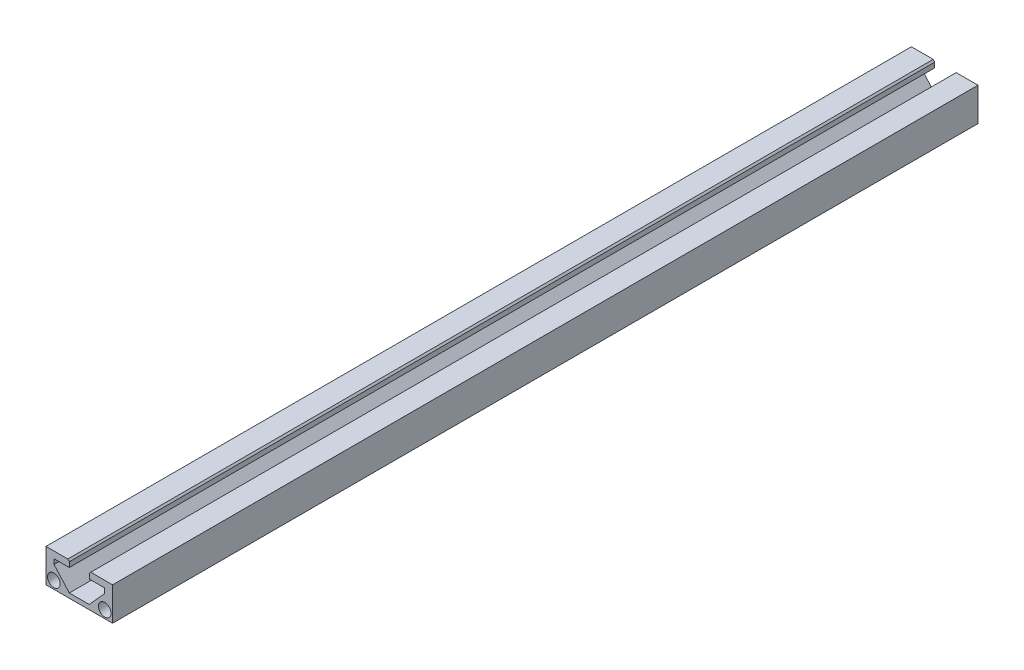
ISO-10303-21;
HEADER;
FILE_DESCRIPTION(('STEP AP214'),'2;1');
FILE_NAME('part.step','',(''),(''),'','','');
FILE_SCHEMA(('AUTOMOTIVE_DESIGN { 1 0 10303 214 1 1 1 1 }'));
ENDSEC;
DATA;
#1=APPLICATION_CONTEXT('core data for automotive mechanical design processes');
#2=APPLICATION_PROTOCOL_DEFINITION('international standard','automotive_design',2000,#1);
#3=PRODUCT_CONTEXT('',#1,'mechanical');
#4=PRODUCT('Part','Part','',(#3));
#5=PRODUCT_RELATED_PRODUCT_CATEGORY('part','',(#4));
#6=PRODUCT_DEFINITION_FORMATION('','',#4);
#7=PRODUCT_DEFINITION_CONTEXT('part definition',#1,'design');
#8=PRODUCT_DEFINITION('design','',#6,#7);
#9=PRODUCT_DEFINITION_SHAPE('','',#8);
#10=(LENGTH_UNIT() NAMED_UNIT(*) SI_UNIT(.MILLI.,.METRE.));
#11=(NAMED_UNIT(*) PLANE_ANGLE_UNIT() SI_UNIT($,.RADIAN.));
#12=(NAMED_UNIT(*) SI_UNIT($,.STERADIAN.) SOLID_ANGLE_UNIT());
#13=UNCERTAINTY_MEASURE_WITH_UNIT(LENGTH_MEASURE(1.E-05),#10,'distance_accuracy_value','');
#14=(GEOMETRIC_REPRESENTATION_CONTEXT(3) GLOBAL_UNCERTAINTY_ASSIGNED_CONTEXT((#13)) GLOBAL_UNIT_ASSIGNED_CONTEXT((#10,
#11,#12)) REPRESENTATION_CONTEXT('',''));
#15=CARTESIAN_POINT('',(0.,0.,0.));
#16=DIRECTION('',(0.,0.,1.));
#17=DIRECTION('',(1.,0.,0.));
#18=AXIS2_PLACEMENT_3D('',#15,#16,#17);
#19=CARTESIAN_POINT('',(3.,0.,130.));
#20=DIRECTION('',(0.,-1.,0.));
#21=DIRECTION('',(1.,0.,0.));
#22=AXIS2_PLACEMENT_3D('',#19,#20,#21);
#23=PLANE('',#22);
#24=DIRECTION('',(-1.,0.,0.));
#25=VECTOR('',#24,1.);
#26=CARTESIAN_POINT('',(3.,0.,-130.));
#27=LINE('',#26,#25);
#28=CARTESIAN_POINT('',(3.,0.,-130.));
#29=VERTEX_POINT('',#28);
#30=CARTESIAN_POINT('',(-3.,0.,-130.));
#31=VERTEX_POINT('',#30);
#32=EDGE_CURVE('E145',#29,#31,#27,.T.);
#33=ORIENTED_EDGE('',*,*,#32,.T.);
#34=DIRECTION('',(0.,0.,-1.));
#35=VECTOR('',#34,1.);
#36=CARTESIAN_POINT('',(-3.,0.,130.));
#37=LINE('',#36,#35);
#38=CARTESIAN_POINT('',(-3.,0.,130.));
#39=VERTEX_POINT('',#38);
#40=EDGE_CURVE('E150',#39,#31,#37,.T.);
#41=ORIENTED_EDGE('',*,*,#40,.F.);
#42=DIRECTION('',(-1.,0.,0.));
#43=VECTOR('',#42,1.);
#44=CARTESIAN_POINT('',(3.,0.,130.));
#45=LINE('',#44,#43);
#46=CARTESIAN_POINT('',(3.,0.,130.));
#47=VERTEX_POINT('',#46);
#48=EDGE_CURVE('E171',#47,#39,#45,.T.);
#49=ORIENTED_EDGE('',*,*,#48,.F.);
#50=DIRECTION('',(0.,0.,-1.));
#51=VECTOR('',#50,1.);
#52=CARTESIAN_POINT('',(3.,0.,130.));
#53=LINE('',#52,#51);
#54=EDGE_CURVE('E141',#47,#29,#53,.T.);
#55=ORIENTED_EDGE('',*,*,#54,.T.);
#56=EDGE_LOOP('',(#33,#41,#49,#55));
#57=FACE_BOUND('',#56,.T.);
#58=ADVANCED_FACE('F39',(#57),#23,.F.);
#59=CARTESIAN_POINT('',(0.,-1.38297872340426,130.));
#60=DIRECTION('',(0.,1.,0.));
#61=DIRECTION('',(0.,0.,1.));
#62=AXIS2_PLACEMENT_3D('',#59,#60,#61);
#63=PLANE('',#62);
#64=DIRECTION('',(1.,0.,0.));
#65=VECTOR('',#64,1.);
#66=CARTESIAN_POINT('',(0.,-1.38297872340426,-130.));
#67=LINE('',#66,#65);
#68=CARTESIAN_POINT('',(-10.,-1.38297872340426,-130.));
#69=VERTEX_POINT('',#68);
#70=CARTESIAN_POINT('',(10.,-1.38297872340426,-130.));
#71=VERTEX_POINT('',#70);
#72=EDGE_CURVE('E149',#69,#71,#67,.T.);
#73=ORIENTED_EDGE('',*,*,#72,.T.);
#74=DIRECTION('',(0.,0.,-1.));
#75=VECTOR('',#74,1.);
#76=CARTESIAN_POINT('',(10.,-1.38297872340426,130.));
#77=LINE('',#76,#75);
#78=CARTESIAN_POINT('',(10.,-1.38297872340426,130.));
#79=VERTEX_POINT('',#78);
#80=EDGE_CURVE('E11',#79,#71,#77,.T.);
#81=ORIENTED_EDGE('',*,*,#80,.F.);
#82=DIRECTION('',(1.,0.,0.));
#83=VECTOR('',#82,1.);
#84=CARTESIAN_POINT('',(0.,-1.38297872340426,130.));
#85=LINE('',#84,#83);
#86=CARTESIAN_POINT('',(-10.,-1.38297872340426,130.));
#87=VERTEX_POINT('',#86);
#88=EDGE_CURVE('E100',#87,#79,#85,.T.);
#89=ORIENTED_EDGE('',*,*,#88,.F.);
#90=DIRECTION('',(0.,0.,-1.));
#91=VECTOR('',#90,1.);
#92=CARTESIAN_POINT('',(-10.,-1.38297872340426,130.));
#93=LINE('',#92,#91);
#94=EDGE_CURVE('E250',#87,#69,#93,.T.);
#95=ORIENTED_EDGE('',*,*,#94,.T.);
#96=EDGE_LOOP('',(#73,#81,#89,#95));
#97=FACE_BOUND('',#96,.T.);
#98=ADVANCED_FACE('F353',(#97),#63,.F.);
#99=CARTESIAN_POINT('',(10.,-1.38297872340426,130.));
#100=DIRECTION('',(-1.,0.,0.));
#101=DIRECTION('',(0.,0.,1.));
#102=AXIS2_PLACEMENT_3D('',#99,#100,#101);
#103=PLANE('',#102);
#104=DIRECTION('',(0.,1.,0.));
#105=VECTOR('',#104,1.);
#106=CARTESIAN_POINT('',(10.,-1.38297872340426,-130.));
#107=LINE('',#106,#105);
#108=CARTESIAN_POINT('',(10.,8.61702127659574,-130.));
#109=VERTEX_POINT('',#108);
#110=EDGE_CURVE('E153',#71,#109,#107,.T.);
#111=ORIENTED_EDGE('',*,*,#110,.T.);
#112=DIRECTION('',(0.,0.,-1.));
#113=VECTOR('',#112,1.);
#114=CARTESIAN_POINT('',(10.,8.61702127659574,130.));
#115=LINE('',#114,#113);
#116=CARTESIAN_POINT('',(10.,8.61702127659574,130.));
#117=VERTEX_POINT('',#116);
#118=EDGE_CURVE('E48',#117,#109,#115,.T.);
#119=ORIENTED_EDGE('',*,*,#118,.F.);
#120=DIRECTION('',(0.,1.,0.));
#121=VECTOR('',#120,1.);
#122=CARTESIAN_POINT('',(10.,-1.38297872340426,130.));
#123=LINE('',#122,#121);
#124=EDGE_CURVE('E216',#79,#117,#123,.T.);
#125=ORIENTED_EDGE('',*,*,#124,.F.);
#126=ORIENTED_EDGE('',*,*,#80,.T.);
#127=EDGE_LOOP('',(#111,#119,#125,#126));
#128=FACE_BOUND('',#127,.T.);
#129=ADVANCED_FACE('F358',(#128),#103,.F.);
#130=CARTESIAN_POINT('',(10.,8.61702127659574,130.));
#131=DIRECTION('',(0.,-1.,0.));
#132=DIRECTION('',(1.,0.,0.));
#133=AXIS2_PLACEMENT_3D('',#130,#131,#132);
#134=PLANE('',#133);
#135=DIRECTION('',(-1.,0.,0.));
#136=VECTOR('',#135,1.);
#137=CARTESIAN_POINT('',(10.,8.61702127659574,-130.));
#138=LINE('',#137,#136);
#139=CARTESIAN_POINT('',(3.44821174677154,8.61702127659574,-130.));
#140=VERTEX_POINT('',#139);
#141=EDGE_CURVE('E156',#109,#140,#138,.T.);
#142=ORIENTED_EDGE('',*,*,#141,.T.);
#143=DIRECTION('',(0.,0.,-1.));
#144=VECTOR('',#143,1.);
#145=CARTESIAN_POINT('',(3.44821174677154,8.61702127659574,130.));
#146=LINE('',#145,#144);
#147=CARTESIAN_POINT('',(3.44821174677154,8.61702127659574,130.));
#148=VERTEX_POINT('',#147);
#149=EDGE_CURVE('E182',#148,#140,#146,.T.);
#150=ORIENTED_EDGE('',*,*,#149,.F.);
#151=DIRECTION('',(-1.,0.,0.));
#152=VECTOR('',#151,1.);
#153=CARTESIAN_POINT('',(10.,8.61702127659574,130.));
#154=LINE('',#153,#152);
#155=EDGE_CURVE('E193',#117,#148,#154,.T.);
#156=ORIENTED_EDGE('',*,*,#155,.F.);
#157=ORIENTED_EDGE('',*,*,#118,.T.);
#158=EDGE_LOOP('',(#142,#150,#156,#157));
#159=FACE_BOUND('',#158,.T.);
#160=ADVANCED_FACE('F191',(#159),#134,.F.);
#161=CARTESIAN_POINT('',(3.44821174677154,8.61702127659574,130.));
#162=DIRECTION('',(0.744616896860696,-0.667492080035073,0.));
#163=DIRECTION('',(0.667492080035073,0.744616896860696,0.));
#164=AXIS2_PLACEMENT_3D('',#161,#162,#163);
#165=PLANE('',#164);
#166=DIRECTION('',(-0.667492080035073,-0.744616896860696,0.));
#167=VECTOR('',#166,1.);
#168=CARTESIAN_POINT('',(3.44821174677154,8.61702127659574,-130.));
#169=LINE('',#168,#167);
#170=CARTESIAN_POINT('',(3.,8.11702127659574,-130.));
#171=VERTEX_POINT('',#170);
#172=EDGE_CURVE('E159',#140,#171,#169,.T.);
#173=ORIENTED_EDGE('',*,*,#172,.T.);
#174=DIRECTION('',(0.,0.,-1.));
#175=VECTOR('',#174,1.);
#176=CARTESIAN_POINT('',(3.,8.11702127659574,130.));
#177=LINE('',#176,#175);
#178=CARTESIAN_POINT('',(3.,8.11702127659574,130.));
#179=VERTEX_POINT('',#178);
#180=EDGE_CURVE('E178',#179,#171,#177,.T.);
#181=ORIENTED_EDGE('',*,*,#180,.F.);
#182=DIRECTION('',(-0.667492080035073,-0.744616896860696,0.));
#183=VECTOR('',#182,1.);
#184=CARTESIAN_POINT('',(3.44821174677154,8.61702127659574,130.));
#185=LINE('',#184,#183);
#186=EDGE_CURVE('E210',#148,#179,#185,.T.);
#187=ORIENTED_EDGE('',*,*,#186,.F.);
#188=ORIENTED_EDGE('',*,*,#149,.T.);
#189=EDGE_LOOP('',(#173,#181,#187,#188));
#190=FACE_BOUND('',#189,.T.);
#191=ADVANCED_FACE('F205',(#190),#165,.F.);
#192=CARTESIAN_POINT('',(3.,8.11702127659574,130.));
#193=DIRECTION('',(1.,0.,0.));
#194=DIRECTION('',(0.,0.,-1.));
#195=AXIS2_PLACEMENT_3D('',#192,#193,#194);
#196=PLANE('',#195);
#197=DIRECTION('',(0.,-1.,0.));
#198=VECTOR('',#197,1.);
#199=CARTESIAN_POINT('',(3.,8.11702127659574,-130.));
#200=LINE('',#199,#198);
#201=CARTESIAN_POINT('',(3.,6.61702127659574,-130.));
#202=VERTEX_POINT('',#201);
#203=EDGE_CURVE('E162',#171,#202,#200,.T.);
#204=ORIENTED_EDGE('',*,*,#203,.T.);
#205=DIRECTION('',(0.,0.,-1.));
#206=VECTOR('',#205,1.);
#207=CARTESIAN_POINT('',(3.,6.61702127659574,130.));
#208=LINE('',#207,#206);
#209=CARTESIAN_POINT('',(3.,6.61702127659574,130.));
#210=VERTEX_POINT('',#209);
#211=EDGE_CURVE('E134',#210,#202,#208,.T.);
#212=ORIENTED_EDGE('',*,*,#211,.F.);
#213=DIRECTION('',(0.,-1.,0.));
#214=VECTOR('',#213,1.);
#215=CARTESIAN_POINT('',(3.,8.11702127659574,130.));
#216=LINE('',#215,#214);
#217=EDGE_CURVE('E123',#179,#210,#216,.T.);
#218=ORIENTED_EDGE('',*,*,#217,.F.);
#219=ORIENTED_EDGE('',*,*,#180,.T.);
#220=EDGE_LOOP('',(#204,#212,#218,#219));
#221=FACE_BOUND('',#220,.T.);
#222=ADVANCED_FACE('F208',(#221),#196,.F.);
#223=CARTESIAN_POINT('',(3.,6.61702127659574,130.));
#224=DIRECTION('',(0.,1.,0.));
#225=DIRECTION('',(0.,0.,1.));
#226=AXIS2_PLACEMENT_3D('',#223,#224,#225);
#227=PLANE('',#226);
#228=DIRECTION('',(1.,0.,0.));
#229=VECTOR('',#228,1.);
#230=CARTESIAN_POINT('',(3.,6.61702127659574,-130.));
#231=LINE('',#230,#229);
#232=CARTESIAN_POINT('',(7.58701808930022,6.61702127659574,-130.));
#233=VERTEX_POINT('',#232);
#234=EDGE_CURVE('E132',#202,#233,#231,.T.);
#235=ORIENTED_EDGE('',*,*,#234,.T.);
#236=DIRECTION('',(0.,0.,-1.));
#237=VECTOR('',#236,1.);
#238=CARTESIAN_POINT('',(7.58701808930022,6.61702127659574,130.));
#239=LINE('',#238,#237);
#240=CARTESIAN_POINT('',(7.58701808930022,6.61702127659574,130.));
#241=VERTEX_POINT('',#240);
#242=EDGE_CURVE('E129',#241,#233,#239,.T.);
#243=ORIENTED_EDGE('',*,*,#242,.F.);
#244=DIRECTION('',(1.,0.,0.));
#245=VECTOR('',#244,1.);
#246=CARTESIAN_POINT('',(3.,6.61702127659574,130.));
#247=LINE('',#246,#245);
#248=EDGE_CURVE('E117',#210,#241,#247,.T.);
#249=ORIENTED_EDGE('',*,*,#248,.F.);
#250=ORIENTED_EDGE('',*,*,#211,.T.);
#251=EDGE_LOOP('',(#235,#243,#249,#250));
#252=FACE_BOUND('',#251,.T.);
#253=ADVANCED_FACE('F130',(#252),#227,.F.);
#254=CARTESIAN_POINT('',(7.58701808930022,6.61702127659574,130.));
#255=DIRECTION('',(1.,0.,0.));
#256=DIRECTION('',(0.,1.,0.));
#257=AXIS2_PLACEMENT_3D('',#254,#255,#256);
#258=PLANE('',#257);
#259=DIRECTION('',(0.,-1.,0.));
#260=VECTOR('',#259,1.);
#261=CARTESIAN_POINT('',(7.58701808930022,6.61702127659574,-130.));
#262=LINE('',#261,#260);
#263=CARTESIAN_POINT('',(7.58701808930022,5.11702127659574,-130.));
#264=VERTEX_POINT('',#263);
#265=EDGE_CURVE('E86',#233,#264,#262,.T.);
#266=ORIENTED_EDGE('',*,*,#265,.T.);
#267=DIRECTION('',(0.,0.,-1.));
#268=VECTOR('',#267,1.);
#269=CARTESIAN_POINT('',(7.58701808930022,5.11702127659574,130.));
#270=LINE('',#269,#268);
#271=CARTESIAN_POINT('',(7.58701808930022,5.11702127659574,130.));
#272=VERTEX_POINT('',#271);
#273=EDGE_CURVE('E135',#272,#264,#270,.T.);
#274=ORIENTED_EDGE('',*,*,#273,.F.);
#275=DIRECTION('',(0.,-1.,0.));
#276=VECTOR('',#275,1.);
#277=CARTESIAN_POINT('',(7.58701808930022,6.61702127659574,130.));
#278=LINE('',#277,#276);
#279=EDGE_CURVE('E121',#241,#272,#278,.T.);
#280=ORIENTED_EDGE('',*,*,#279,.F.);
#281=ORIENTED_EDGE('',*,*,#242,.T.);
#282=EDGE_LOOP('',(#266,#274,#280,#281));
#283=FACE_BOUND('',#282,.T.);
#284=ADVANCED_FACE('F137',(#283),#258,.F.);
#285=CARTESIAN_POINT('',(7.58701808930022,5.11702127659574,130.));
#286=DIRECTION('',(0.744616896860696,-0.667492080035072,0.));
#287=DIRECTION('',(0.667492080035072,0.744616896860696,0.));
#288=AXIS2_PLACEMENT_3D('',#285,#286,#287);
#289=PLANE('',#288);
#290=DIRECTION('',(-0.667492080035072,-0.744616896860696,0.));
#291=VECTOR('',#290,1.);
#292=CARTESIAN_POINT('',(7.58701808930022,5.11702127659574,-130.));
#293=LINE('',#292,#291);
#294=EDGE_CURVE('E92',#264,#29,#293,.T.);
#295=ORIENTED_EDGE('',*,*,#294,.T.);
#296=ORIENTED_EDGE('',*,*,#54,.F.);
#297=DIRECTION('',(-0.667492080035072,-0.744616896860696,0.));
#298=VECTOR('',#297,1.);
#299=CARTESIAN_POINT('',(7.58701808930022,5.11702127659574,130.));
#300=LINE('',#299,#298);
#301=EDGE_CURVE('E56',#272,#47,#300,.T.);
#302=ORIENTED_EDGE('',*,*,#301,.F.);
#303=ORIENTED_EDGE('',*,*,#273,.T.);
#304=EDGE_LOOP('',(#295,#296,#302,#303));
#305=FACE_BOUND('',#304,.T.);
#306=ADVANCED_FACE('F344',(#305),#289,.F.);
#307=CARTESIAN_POINT('',(0.,0.,130.));
#308=DIRECTION('',(0.,0.,1.));
#309=DIRECTION('',(1.,0.,0.));
#310=AXIS2_PLACEMENT_3D('',#307,#308,#309);
#311=PLANE('',#310);
#312=CARTESIAN_POINT('',(-7.64671625703689,0.970305019558831,130.));
#313=DIRECTION('',(0.,0.,-1.));
#314=DIRECTION('',(-1.,0.,0.));
#315=AXIS2_PLACEMENT_3D('',#312,#313,#314);
#316=CIRCLE('',#315,1.9);
#317=CARTESIAN_POINT('',(-9.54671625703689,0.970305019558831,130.));
#318=VERTEX_POINT('',#317);
#319=EDGE_CURVE('E319',#318,#318,#316,.T.);
#320=ORIENTED_EDGE('',*,*,#319,.T.);
#321=EDGE_LOOP('',(#320));
#322=FACE_BOUND('',#321,.T.);
#323=CARTESIAN_POINT('',(7.64671625703689,0.970305019558831,130.));
#324=DIRECTION('',(0.,0.,1.));
#325=DIRECTION('',(1.,0.,0.));
#326=AXIS2_PLACEMENT_3D('',#323,#324,#325);
#327=CIRCLE('',#326,1.9);
#328=CARTESIAN_POINT('',(9.54671625703689,0.970305019558831,130.));
#329=VERTEX_POINT('',#328);
#330=EDGE_CURVE('E311',#329,#329,#327,.T.);
#331=ORIENTED_EDGE('',*,*,#330,.F.);
#332=EDGE_LOOP('',(#331));
#333=FACE_BOUND('',#332,.T.);
#334=ORIENTED_EDGE('',*,*,#48,.T.);
#335=DIRECTION('',(0.667492080035072,-0.744616896860696,0.));
#336=VECTOR('',#335,1.);
#337=CARTESIAN_POINT('',(-7.58701808930022,5.11702127659574,130.));
#338=LINE('',#337,#336);
#339=CARTESIAN_POINT('',(-7.58701808930022,5.11702127659574,130.));
#340=VERTEX_POINT('',#339);
#341=EDGE_CURVE('E259',#340,#39,#338,.T.);
#342=ORIENTED_EDGE('',*,*,#341,.F.);
#343=DIRECTION('',(0.,-1.,0.));
#344=VECTOR('',#343,1.);
#345=CARTESIAN_POINT('',(-7.58701808930022,6.61702127659574,130.));
#346=LINE('',#345,#344);
#347=CARTESIAN_POINT('',(-7.58701808930022,6.61702127659574,130.));
#348=VERTEX_POINT('',#347);
#349=EDGE_CURVE('E304',#348,#340,#346,.T.);
#350=ORIENTED_EDGE('',*,*,#349,.F.);
#351=DIRECTION('',(-1.,0.,0.));
#352=VECTOR('',#351,1.);
#353=CARTESIAN_POINT('',(-3.,6.61702127659574,130.));
#354=LINE('',#353,#352);
#355=CARTESIAN_POINT('',(-3.,6.61702127659574,130.));
#356=VERTEX_POINT('',#355);
#357=EDGE_CURVE('E300',#356,#348,#354,.T.);
#358=ORIENTED_EDGE('',*,*,#357,.F.);
#359=DIRECTION('',(0.,-1.,0.));
#360=VECTOR('',#359,1.);
#361=CARTESIAN_POINT('',(-3.,8.11702127659574,130.));
#362=LINE('',#361,#360);
#363=CARTESIAN_POINT('',(-3.,8.11702127659574,130.));
#364=VERTEX_POINT('',#363);
#365=EDGE_CURVE('E296',#364,#356,#362,.T.);
#366=ORIENTED_EDGE('',*,*,#365,.F.);
#367=DIRECTION('',(0.667492080035073,-0.744616896860696,0.));
#368=VECTOR('',#367,1.);
#369=CARTESIAN_POINT('',(-3.44821174677154,8.61702127659574,130.));
#370=LINE('',#369,#368);
#371=CARTESIAN_POINT('',(-3.44821174677154,8.61702127659574,130.));
#372=VERTEX_POINT('',#371);
#373=EDGE_CURVE('E292',#372,#364,#370,.T.);
#374=ORIENTED_EDGE('',*,*,#373,.F.);
#375=DIRECTION('',(1.,0.,0.));
#376=VECTOR('',#375,1.);
#377=CARTESIAN_POINT('',(-10.,8.61702127659574,130.));
#378=LINE('',#377,#376);
#379=CARTESIAN_POINT('',(-10.,8.61702127659574,130.));
#380=VERTEX_POINT('',#379);
#381=EDGE_CURVE('E288',#380,#372,#378,.T.);
#382=ORIENTED_EDGE('',*,*,#381,.F.);
#383=DIRECTION('',(0.,1.,0.));
#384=VECTOR('',#383,1.);
#385=CARTESIAN_POINT('',(-10.,-1.38297872340426,130.));
#386=LINE('',#385,#384);
#387=EDGE_CURVE('E254',#87,#380,#386,.T.);
#388=ORIENTED_EDGE('',*,*,#387,.F.);
#389=ORIENTED_EDGE('',*,*,#88,.T.);
#390=ORIENTED_EDGE('',*,*,#124,.T.);
#391=ORIENTED_EDGE('',*,*,#155,.T.);
#392=ORIENTED_EDGE('',*,*,#186,.T.);
#393=ORIENTED_EDGE('',*,*,#217,.T.);
#394=ORIENTED_EDGE('',*,*,#248,.T.);
#395=ORIENTED_EDGE('',*,*,#279,.T.);
#396=ORIENTED_EDGE('',*,*,#301,.T.);
#397=EDGE_LOOP('',(#334,#342,#350,#358,#366,#374,#382,#388,#389,#390,#391,#392,#393,#394,#395,#396));
#398=FACE_BOUND('',#397,.T.);
#399=ADVANCED_FACE('F119',(#322,#333,#398),#311,.T.);
#400=CARTESIAN_POINT('',(0.,0.,-130.));
#401=DIRECTION('',(0.,0.,1.));
#402=DIRECTION('',(1.,0.,0.));
#403=AXIS2_PLACEMENT_3D('',#400,#401,#402);
#404=PLANE('',#403);
#405=CARTESIAN_POINT('',(-7.64671625703689,0.970305019558831,-130.));
#406=DIRECTION('',(0.,0.,-1.));
#407=DIRECTION('',(-1.,0.,0.));
#408=AXIS2_PLACEMENT_3D('',#405,#406,#407);
#409=CIRCLE('',#408,1.9);
#410=CARTESIAN_POINT('',(-9.54671625703689,0.970305019558831,-130.));
#411=VERTEX_POINT('',#410);
#412=EDGE_CURVE('E315',#411,#411,#409,.T.);
#413=ORIENTED_EDGE('',*,*,#412,.F.);
#414=EDGE_LOOP('',(#413));
#415=FACE_BOUND('',#414,.T.);
#416=CARTESIAN_POINT('',(7.64671625703689,0.970305019558831,-130.));
#417=DIRECTION('',(0.,0.,1.));
#418=DIRECTION('',(1.,0.,0.));
#419=AXIS2_PLACEMENT_3D('',#416,#417,#418);
#420=CIRCLE('',#419,1.9);
#421=CARTESIAN_POINT('',(9.54671625703689,0.970305019558831,-130.));
#422=VERTEX_POINT('',#421);
#423=EDGE_CURVE('E284',#422,#422,#420,.T.);
#424=ORIENTED_EDGE('',*,*,#423,.T.);
#425=EDGE_LOOP('',(#424));
#426=FACE_BOUND('',#425,.T.);
#427=ORIENTED_EDGE('',*,*,#32,.F.);
#428=ORIENTED_EDGE('',*,*,#294,.F.);
#429=ORIENTED_EDGE('',*,*,#265,.F.);
#430=ORIENTED_EDGE('',*,*,#234,.F.);
#431=ORIENTED_EDGE('',*,*,#203,.F.);
#432=ORIENTED_EDGE('',*,*,#172,.F.);
#433=ORIENTED_EDGE('',*,*,#141,.F.);
#434=ORIENTED_EDGE('',*,*,#110,.F.);
#435=ORIENTED_EDGE('',*,*,#72,.F.);
#436=DIRECTION('',(0.,1.,0.));
#437=VECTOR('',#436,1.);
#438=CARTESIAN_POINT('',(-10.,-1.38297872340426,-130.));
#439=LINE('',#438,#437);
#440=CARTESIAN_POINT('',(-10.,8.61702127659574,-130.));
#441=VERTEX_POINT('',#440);
#442=EDGE_CURVE('E255',#69,#441,#439,.T.);
#443=ORIENTED_EDGE('',*,*,#442,.T.);
#444=DIRECTION('',(1.,0.,0.));
#445=VECTOR('',#444,1.);
#446=CARTESIAN_POINT('',(-10.,8.61702127659574,-130.));
#447=LINE('',#446,#445);
#448=CARTESIAN_POINT('',(-3.44821174677154,8.61702127659574,-130.));
#449=VERTEX_POINT('',#448);
#450=EDGE_CURVE('E260',#441,#449,#447,.T.);
#451=ORIENTED_EDGE('',*,*,#450,.T.);
#452=DIRECTION('',(0.667492080035073,-0.744616896860696,0.));
#453=VECTOR('',#452,1.);
#454=CARTESIAN_POINT('',(-3.44821174677154,8.61702127659574,-130.));
#455=LINE('',#454,#453);
#456=CARTESIAN_POINT('',(-3.,8.11702127659574,-130.));
#457=VERTEX_POINT('',#456);
#458=EDGE_CURVE('E264',#449,#457,#455,.T.);
#459=ORIENTED_EDGE('',*,*,#458,.T.);
#460=DIRECTION('',(0.,-1.,0.));
#461=VECTOR('',#460,1.);
#462=CARTESIAN_POINT('',(-3.,8.11702127659574,-130.));
#463=LINE('',#462,#461);
#464=CARTESIAN_POINT('',(-3.,6.61702127659574,-130.));
#465=VERTEX_POINT('',#464);
#466=EDGE_CURVE('E268',#457,#465,#463,.T.);
#467=ORIENTED_EDGE('',*,*,#466,.T.);
#468=DIRECTION('',(-1.,0.,0.));
#469=VECTOR('',#468,1.);
#470=CARTESIAN_POINT('',(-3.,6.61702127659574,-130.));
#471=LINE('',#470,#469);
#472=CARTESIAN_POINT('',(-7.58701808930022,6.61702127659574,-130.));
#473=VERTEX_POINT('',#472);
#474=EDGE_CURVE('E272',#465,#473,#471,.T.);
#475=ORIENTED_EDGE('',*,*,#474,.T.);
#476=DIRECTION('',(0.,-1.,0.));
#477=VECTOR('',#476,1.);
#478=CARTESIAN_POINT('',(-7.58701808930022,6.61702127659574,-130.));
#479=LINE('',#478,#477);
#480=CARTESIAN_POINT('',(-7.58701808930022,5.11702127659574,-130.));
#481=VERTEX_POINT('',#480);
#482=EDGE_CURVE('E276',#473,#481,#479,.T.);
#483=ORIENTED_EDGE('',*,*,#482,.T.);
#484=DIRECTION('',(0.667492080035072,-0.744616896860696,0.));
#485=VECTOR('',#484,1.);
#486=CARTESIAN_POINT('',(-7.58701808930022,5.11702127659574,-130.));
#487=LINE('',#486,#485);
#488=EDGE_CURVE('E280',#481,#31,#487,.T.);
#489=ORIENTED_EDGE('',*,*,#488,.T.);
#490=EDGE_LOOP('',(#427,#428,#429,#430,#431,#432,#433,#434,#435,#443,#451,#459,#467,#475,#483,#489));
#491=FACE_BOUND('',#490,.T.);
#492=ADVANCED_FACE('F200',(#415,#426,#491),#404,.F.);
#493=CARTESIAN_POINT('',(-7.58701808930022,5.11702127659574,130.));
#494=DIRECTION('',(0.744616896860696,0.667492080035072,0.));
#495=DIRECTION('',(-0.667492080035072,0.744616896860696,0.));
#496=AXIS2_PLACEMENT_3D('',#493,#494,#495);
#497=PLANE('',#496);
#498=ORIENTED_EDGE('',*,*,#488,.F.);
#499=DIRECTION('',(0.,0.,-1.));
#500=VECTOR('',#499,1.);
#501=CARTESIAN_POINT('',(-7.58701808930022,5.11702127659574,130.));
#502=LINE('',#501,#500);
#503=EDGE_CURVE('E226',#340,#481,#502,.T.);
#504=ORIENTED_EDGE('',*,*,#503,.F.);
#505=ORIENTED_EDGE('',*,*,#341,.T.);
#506=ORIENTED_EDGE('',*,*,#40,.T.);
#507=EDGE_LOOP('',(#498,#504,#505,#506));
#508=FACE_BOUND('',#507,.T.);
#509=ADVANCED_FACE('F332',(#508),#497,.T.);
#510=CARTESIAN_POINT('',(-7.58701808930022,6.61702127659574,130.));
#511=DIRECTION('',(1.,0.,0.));
#512=DIRECTION('',(0.,1.,0.));
#513=AXIS2_PLACEMENT_3D('',#510,#511,#512);
#514=PLANE('',#513);
#515=ORIENTED_EDGE('',*,*,#482,.F.);
#516=DIRECTION('',(0.,0.,-1.));
#517=VECTOR('',#516,1.);
#518=CARTESIAN_POINT('',(-7.58701808930022,6.61702127659574,130.));
#519=LINE('',#518,#517);
#520=EDGE_CURVE('E230',#348,#473,#519,.T.);
#521=ORIENTED_EDGE('',*,*,#520,.F.);
#522=ORIENTED_EDGE('',*,*,#349,.T.);
#523=ORIENTED_EDGE('',*,*,#503,.T.);
#524=EDGE_LOOP('',(#515,#521,#522,#523));
#525=FACE_BOUND('',#524,.T.);
#526=ADVANCED_FACE('F376',(#525),#514,.T.);
#527=CARTESIAN_POINT('',(-3.,6.61702127659574,130.));
#528=DIRECTION('',(0.,-1.,0.));
#529=DIRECTION('',(0.,0.,-1.));
#530=AXIS2_PLACEMENT_3D('',#527,#528,#529);
#531=PLANE('',#530);
#532=ORIENTED_EDGE('',*,*,#474,.F.);
#533=DIRECTION('',(0.,0.,-1.));
#534=VECTOR('',#533,1.);
#535=CARTESIAN_POINT('',(-3.,6.61702127659574,130.));
#536=LINE('',#535,#534);
#537=EDGE_CURVE('E234',#356,#465,#536,.T.);
#538=ORIENTED_EDGE('',*,*,#537,.F.);
#539=ORIENTED_EDGE('',*,*,#357,.T.);
#540=ORIENTED_EDGE('',*,*,#520,.T.);
#541=EDGE_LOOP('',(#532,#538,#539,#540));
#542=FACE_BOUND('',#541,.T.);
#543=ADVANCED_FACE('F421',(#542),#531,.T.);
#544=CARTESIAN_POINT('',(-3.,8.11702127659574,130.));
#545=DIRECTION('',(1.,0.,0.));
#546=DIRECTION('',(0.,0.,-1.));
#547=AXIS2_PLACEMENT_3D('',#544,#545,#546);
#548=PLANE('',#547);
#549=ORIENTED_EDGE('',*,*,#466,.F.);
#550=DIRECTION('',(0.,0.,-1.));
#551=VECTOR('',#550,1.);
#552=CARTESIAN_POINT('',(-3.,8.11702127659574,130.));
#553=LINE('',#552,#551);
#554=EDGE_CURVE('E238',#364,#457,#553,.T.);
#555=ORIENTED_EDGE('',*,*,#554,.F.);
#556=ORIENTED_EDGE('',*,*,#365,.T.);
#557=ORIENTED_EDGE('',*,*,#537,.T.);
#558=EDGE_LOOP('',(#549,#555,#556,#557));
#559=FACE_BOUND('',#558,.T.);
#560=ADVANCED_FACE('F419',(#559),#548,.T.);
#561=CARTESIAN_POINT('',(-3.44821174677154,8.61702127659574,130.));
#562=DIRECTION('',(0.744616896860696,0.667492080035073,0.));
#563=DIRECTION('',(-0.667492080035073,0.744616896860696,0.));
#564=AXIS2_PLACEMENT_3D('',#561,#562,#563);
#565=PLANE('',#564);
#566=ORIENTED_EDGE('',*,*,#458,.F.);
#567=DIRECTION('',(0.,0.,-1.));
#568=VECTOR('',#567,1.);
#569=CARTESIAN_POINT('',(-3.44821174677154,8.61702127659574,130.));
#570=LINE('',#569,#568);
#571=EDGE_CURVE('E242',#372,#449,#570,.T.);
#572=ORIENTED_EDGE('',*,*,#571,.F.);
#573=ORIENTED_EDGE('',*,*,#373,.T.);
#574=ORIENTED_EDGE('',*,*,#554,.T.);
#575=EDGE_LOOP('',(#566,#572,#573,#574));
#576=FACE_BOUND('',#575,.T.);
#577=ADVANCED_FACE('F417',(#576),#565,.T.);
#578=CARTESIAN_POINT('',(-10.,8.61702127659574,130.));
#579=DIRECTION('',(0.,1.,0.));
#580=DIRECTION('',(-1.,0.,0.));
#581=AXIS2_PLACEMENT_3D('',#578,#579,#580);
#582=PLANE('',#581);
#583=ORIENTED_EDGE('',*,*,#450,.F.);
#584=DIRECTION('',(0.,0.,-1.));
#585=VECTOR('',#584,1.);
#586=CARTESIAN_POINT('',(-10.,8.61702127659574,130.));
#587=LINE('',#586,#585);
#588=EDGE_CURVE('E246',#380,#441,#587,.T.);
#589=ORIENTED_EDGE('',*,*,#588,.F.);
#590=ORIENTED_EDGE('',*,*,#381,.T.);
#591=ORIENTED_EDGE('',*,*,#571,.T.);
#592=EDGE_LOOP('',(#583,#589,#590,#591));
#593=FACE_BOUND('',#592,.T.);
#594=ADVANCED_FACE('F413',(#593),#582,.T.);
#595=CARTESIAN_POINT('',(-10.,-1.38297872340426,130.));
#596=DIRECTION('',(-1.,0.,0.));
#597=DIRECTION('',(0.,0.,1.));
#598=AXIS2_PLACEMENT_3D('',#595,#596,#597);
#599=PLANE('',#598);
#600=ORIENTED_EDGE('',*,*,#442,.F.);
#601=ORIENTED_EDGE('',*,*,#94,.F.);
#602=ORIENTED_EDGE('',*,*,#387,.T.);
#603=ORIENTED_EDGE('',*,*,#588,.T.);
#604=EDGE_LOOP('',(#600,#601,#602,#603));
#605=FACE_BOUND('',#604,.T.);
#606=ADVANCED_FACE('F339',(#605),#599,.T.);
#607=CARTESIAN_POINT('',(7.64671625703689,0.970305019558831,-130.));
#608=DIRECTION('',(0.,0.,1.));
#609=DIRECTION('',(1.,0.,0.));
#610=AXIS2_PLACEMENT_3D('',#607,#608,#609);
#611=CYLINDRICAL_SURFACE('',#610,1.9);
#612=ORIENTED_EDGE('',*,*,#423,.F.);
#613=EDGE_LOOP('',(#612));
#614=FACE_BOUND('',#613,.T.);
#615=ORIENTED_EDGE('',*,*,#330,.T.);
#616=EDGE_LOOP('',(#615));
#617=FACE_BOUND('',#616,.T.);
#618=ADVANCED_FACE('F336',(#614,#617),#611,.F.);
#619=CARTESIAN_POINT('',(-7.64671625703689,0.970305019558831,-130.));
#620=DIRECTION('',(0.,0.,1.));
#621=DIRECTION('',(1.,0.,0.));
#622=AXIS2_PLACEMENT_3D('',#619,#620,#621);
#623=CYLINDRICAL_SURFACE('',#622,1.9);
#624=ORIENTED_EDGE('',*,*,#412,.T.);
#625=EDGE_LOOP('',(#624));
#626=FACE_BOUND('',#625,.T.);
#627=ORIENTED_EDGE('',*,*,#319,.F.);
#628=EDGE_LOOP('',(#627));
#629=FACE_BOUND('',#628,.T.);
#630=ADVANCED_FACE('F327',(#626,#629),#623,.F.);
#631=CLOSED_SHELL('',(#58,#98,#129,#160,#191,#222,#253,#284,#306,#399,#492,#509,#526,#543,#560,
#577,#594,#606,#618,#630));
#632=MANIFOLD_SOLID_BREP('B2',#631);
#633=ADVANCED_BREP_SHAPE_REPRESENTATION('',(#18,#632),#14);
#634=SHAPE_DEFINITION_REPRESENTATION(#9,#633);
ENDSEC;
END-ISO-10303-21;
